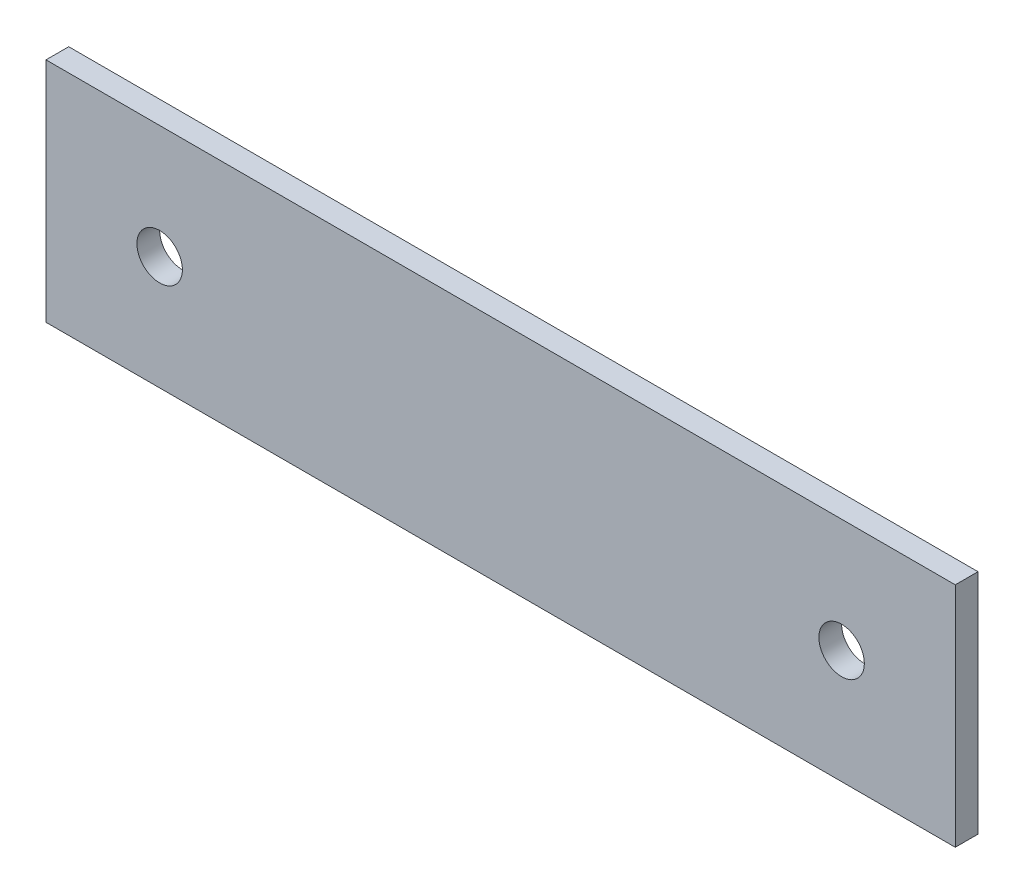
ISO-10303-21;
HEADER;
FILE_DESCRIPTION(('STEP AP214'),'2;1');
FILE_NAME('part.step','',(''),(''),'','','');
FILE_SCHEMA(('AUTOMOTIVE_DESIGN { 1 0 10303 214 1 1 1 1 }'));
ENDSEC;
DATA;
#1=APPLICATION_CONTEXT('core data for automotive mechanical design processes');
#2=APPLICATION_PROTOCOL_DEFINITION('international standard','automotive_design',2000,#1);
#3=PRODUCT_CONTEXT('',#1,'mechanical');
#4=PRODUCT('Part','Part','',(#3));
#5=PRODUCT_RELATED_PRODUCT_CATEGORY('part','',(#4));
#6=PRODUCT_DEFINITION_FORMATION('','',#4);
#7=PRODUCT_DEFINITION_CONTEXT('part definition',#1,'design');
#8=PRODUCT_DEFINITION('design','',#6,#7);
#9=PRODUCT_DEFINITION_SHAPE('','',#8);
#10=(LENGTH_UNIT() NAMED_UNIT(*) SI_UNIT(.MILLI.,.METRE.));
#11=(NAMED_UNIT(*) PLANE_ANGLE_UNIT() SI_UNIT($,.RADIAN.));
#12=(NAMED_UNIT(*) SI_UNIT($,.STERADIAN.) SOLID_ANGLE_UNIT());
#13=UNCERTAINTY_MEASURE_WITH_UNIT(LENGTH_MEASURE(1.E-05),#10,'distance_accuracy_value','');
#14=(GEOMETRIC_REPRESENTATION_CONTEXT(3) GLOBAL_UNCERTAINTY_ASSIGNED_CONTEXT((#13)) GLOBAL_UNIT_ASSIGNED_CONTEXT((#10,
#11,#12)) REPRESENTATION_CONTEXT('',''));
#15=CARTESIAN_POINT('',(0.,0.,0.));
#16=DIRECTION('',(0.,0.,1.));
#17=DIRECTION('',(1.,0.,0.));
#18=AXIS2_PLACEMENT_3D('',#15,#16,#17);
#19=CARTESIAN_POINT('',(40.,10.,2.));
#20=DIRECTION('',(-1.,0.,0.));
#21=DIRECTION('',(0.,-1.,0.));
#22=AXIS2_PLACEMENT_3D('',#19,#20,#21);
#23=PLANE('',#22);
#24=DIRECTION('',(0.,1.,0.));
#25=VECTOR('',#24,1.);
#26=CARTESIAN_POINT('',(40.,10.,0.));
#27=LINE('',#26,#25);
#28=CARTESIAN_POINT('',(40.,-10.,0.));
#29=VERTEX_POINT('',#28);
#30=CARTESIAN_POINT('',(40.,10.,0.));
#31=VERTEX_POINT('',#30);
#32=EDGE_CURVE('E97',#29,#31,#27,.T.);
#33=ORIENTED_EDGE('',*,*,#32,.T.);
#34=DIRECTION('',(0.,0.,-1.));
#35=VECTOR('',#34,1.);
#36=CARTESIAN_POINT('',(40.,10.,2.));
#37=LINE('',#36,#35);
#38=CARTESIAN_POINT('',(40.,10.,2.));
#39=VERTEX_POINT('',#38);
#40=EDGE_CURVE('E11',#39,#31,#37,.T.);
#41=ORIENTED_EDGE('',*,*,#40,.F.);
#42=DIRECTION('',(0.,1.,0.));
#43=VECTOR('',#42,1.);
#44=CARTESIAN_POINT('',(40.,10.,2.));
#45=LINE('',#44,#43);
#46=CARTESIAN_POINT('',(40.,-10.,2.));
#47=VERTEX_POINT('',#46);
#48=EDGE_CURVE('E85',#47,#39,#45,.T.);
#49=ORIENTED_EDGE('',*,*,#48,.F.);
#50=DIRECTION('',(0.,0.,-1.));
#51=VECTOR('',#50,1.);
#52=CARTESIAN_POINT('',(40.,-10.,2.));
#53=LINE('',#52,#51);
#54=EDGE_CURVE('E93',#47,#29,#53,.T.);
#55=ORIENTED_EDGE('',*,*,#54,.T.);
#56=EDGE_LOOP('',(#33,#41,#49,#55));
#57=FACE_BOUND('',#56,.T.);
#58=ADVANCED_FACE('F34',(#57),#23,.F.);
#59=CARTESIAN_POINT('',(-40.,10.,2.));
#60=DIRECTION('',(0.,-1.,0.));
#61=DIRECTION('',(1.,0.,0.));
#62=AXIS2_PLACEMENT_3D('',#59,#60,#61);
#63=PLANE('',#62);
#64=DIRECTION('',(-1.,0.,0.));
#65=VECTOR('',#64,1.);
#66=CARTESIAN_POINT('',(-40.,10.,0.));
#67=LINE('',#66,#65);
#68=CARTESIAN_POINT('',(-40.,10.,0.));
#69=VERTEX_POINT('',#68);
#70=EDGE_CURVE('E89',#31,#69,#67,.T.);
#71=ORIENTED_EDGE('',*,*,#70,.T.);
#72=DIRECTION('',(0.,0.,-1.));
#73=VECTOR('',#72,1.);
#74=CARTESIAN_POINT('',(-40.,10.,2.));
#75=LINE('',#74,#73);
#76=CARTESIAN_POINT('',(-40.,10.,2.));
#77=VERTEX_POINT('',#76);
#78=EDGE_CURVE('E42',#77,#69,#75,.T.);
#79=ORIENTED_EDGE('',*,*,#78,.F.);
#80=DIRECTION('',(-1.,0.,0.));
#81=VECTOR('',#80,1.);
#82=CARTESIAN_POINT('',(-40.,10.,2.));
#83=LINE('',#82,#81);
#84=EDGE_CURVE('E80',#39,#77,#83,.T.);
#85=ORIENTED_EDGE('',*,*,#84,.F.);
#86=ORIENTED_EDGE('',*,*,#40,.T.);
#87=EDGE_LOOP('',(#71,#79,#85,#86));
#88=FACE_BOUND('',#87,.T.);
#89=ADVANCED_FACE('F88',(#88),#63,.F.);
#90=CARTESIAN_POINT('',(-40.,10.,2.));
#91=DIRECTION('',(1.,0.,0.));
#92=DIRECTION('',(0.,0.,-1.));
#93=AXIS2_PLACEMENT_3D('',#90,#91,#92);
#94=PLANE('',#93);
#95=DIRECTION('',(0.,-1.,0.));
#96=VECTOR('',#95,1.);
#97=CARTESIAN_POINT('',(-40.,10.,0.));
#98=LINE('',#97,#96);
#99=CARTESIAN_POINT('',(-40.,-10.,0.));
#100=VERTEX_POINT('',#99);
#101=EDGE_CURVE('E67',#69,#100,#98,.T.);
#102=ORIENTED_EDGE('',*,*,#101,.T.);
#103=DIRECTION('',(0.,0.,-1.));
#104=VECTOR('',#103,1.);
#105=CARTESIAN_POINT('',(-40.,-10.,2.));
#106=LINE('',#105,#104);
#107=CARTESIAN_POINT('',(-40.,-10.,2.));
#108=VERTEX_POINT('',#107);
#109=EDGE_CURVE('E90',#108,#100,#106,.T.);
#110=ORIENTED_EDGE('',*,*,#109,.F.);
#111=DIRECTION('',(0.,-1.,0.));
#112=VECTOR('',#111,1.);
#113=CARTESIAN_POINT('',(-40.,10.,2.));
#114=LINE('',#113,#112);
#115=EDGE_CURVE('E83',#77,#108,#114,.T.);
#116=ORIENTED_EDGE('',*,*,#115,.F.);
#117=ORIENTED_EDGE('',*,*,#78,.T.);
#118=EDGE_LOOP('',(#102,#110,#116,#117));
#119=FACE_BOUND('',#118,.T.);
#120=ADVANCED_FACE('F91',(#119),#94,.F.);
#121=CARTESIAN_POINT('',(-40.,-10.,2.));
#122=DIRECTION('',(0.,1.,0.));
#123=DIRECTION('',(0.,0.,1.));
#124=AXIS2_PLACEMENT_3D('',#121,#122,#123);
#125=PLANE('',#124);
#126=DIRECTION('',(1.,0.,0.));
#127=VECTOR('',#126,1.);
#128=CARTESIAN_POINT('',(-40.,-10.,0.));
#129=LINE('',#128,#127);
#130=EDGE_CURVE('E73',#100,#29,#129,.T.);
#131=ORIENTED_EDGE('',*,*,#130,.T.);
#132=ORIENTED_EDGE('',*,*,#54,.F.);
#133=DIRECTION('',(1.,0.,0.));
#134=VECTOR('',#133,1.);
#135=CARTESIAN_POINT('',(-40.,-10.,2.));
#136=LINE('',#135,#134);
#137=EDGE_CURVE('E50',#108,#47,#136,.T.);
#138=ORIENTED_EDGE('',*,*,#137,.F.);
#139=ORIENTED_EDGE('',*,*,#109,.T.);
#140=EDGE_LOOP('',(#131,#132,#138,#139));
#141=FACE_BOUND('',#140,.T.);
#142=ADVANCED_FACE('F105',(#141),#125,.F.);
#143=CARTESIAN_POINT('',(0.,0.,2.));
#144=DIRECTION('',(0.,0.,1.));
#145=DIRECTION('',(1.,0.,0.));
#146=AXIS2_PLACEMENT_3D('',#143,#144,#145);
#147=PLANE('',#146);
#148=CARTESIAN_POINT('',(-30.,0.,2.));
#149=DIRECTION('',(0.,0.,1.));
#150=DIRECTION('',(1.,0.,0.));
#151=AXIS2_PLACEMENT_3D('',#148,#149,#150);
#152=CIRCLE('',#151,2.);
#153=CARTESIAN_POINT('',(-28.,0.,2.));
#154=VERTEX_POINT('',#153);
#155=EDGE_CURVE('E117',#154,#154,#152,.T.);
#156=ORIENTED_EDGE('',*,*,#155,.F.);
#157=EDGE_LOOP('',(#156));
#158=FACE_BOUND('',#157,.T.);
#159=CARTESIAN_POINT('',(30.,0.,2.));
#160=DIRECTION('',(0.,0.,1.));
#161=DIRECTION('',(1.,0.,0.));
#162=AXIS2_PLACEMENT_3D('',#159,#160,#161);
#163=CIRCLE('',#162,2.00000000000001);
#164=CARTESIAN_POINT('',(32.,0.,2.));
#165=VERTEX_POINT('',#164);
#166=EDGE_CURVE('E111',#165,#165,#163,.T.);
#167=ORIENTED_EDGE('',*,*,#166,.F.);
#168=EDGE_LOOP('',(#167));
#169=FACE_BOUND('',#168,.T.);
#170=ORIENTED_EDGE('',*,*,#48,.T.);
#171=ORIENTED_EDGE('',*,*,#84,.T.);
#172=ORIENTED_EDGE('',*,*,#115,.T.);
#173=ORIENTED_EDGE('',*,*,#137,.T.);
#174=EDGE_LOOP('',(#170,#171,#172,#173));
#175=FACE_BOUND('',#174,.T.);
#176=ADVANCED_FACE('F81',(#158,#169,#175),#147,.T.);
#177=CARTESIAN_POINT('',(0.,0.,0.));
#178=DIRECTION('',(0.,0.,1.));
#179=DIRECTION('',(1.,0.,0.));
#180=AXIS2_PLACEMENT_3D('',#177,#178,#179);
#181=PLANE('',#180);
#182=CARTESIAN_POINT('',(-30.,0.,0.));
#183=DIRECTION('',(0.,0.,1.));
#184=DIRECTION('',(1.,0.,0.));
#185=AXIS2_PLACEMENT_3D('',#182,#183,#184);
#186=CIRCLE('',#185,2.);
#187=CARTESIAN_POINT('',(-28.,0.,0.));
#188=VERTEX_POINT('',#187);
#189=EDGE_CURVE('E100',#188,#188,#186,.T.);
#190=ORIENTED_EDGE('',*,*,#189,.T.);
#191=EDGE_LOOP('',(#190));
#192=FACE_BOUND('',#191,.T.);
#193=CARTESIAN_POINT('',(30.,0.,0.));
#194=DIRECTION('',(0.,0.,1.));
#195=DIRECTION('',(1.,0.,0.));
#196=AXIS2_PLACEMENT_3D('',#193,#194,#195);
#197=CIRCLE('',#196,2.00000000000001);
#198=CARTESIAN_POINT('',(32.,0.,0.));
#199=VERTEX_POINT('',#198);
#200=EDGE_CURVE('E114',#199,#199,#197,.T.);
#201=ORIENTED_EDGE('',*,*,#200,.T.);
#202=EDGE_LOOP('',(#201));
#203=FACE_BOUND('',#202,.T.);
#204=ORIENTED_EDGE('',*,*,#32,.F.);
#205=ORIENTED_EDGE('',*,*,#130,.F.);
#206=ORIENTED_EDGE('',*,*,#101,.F.);
#207=ORIENTED_EDGE('',*,*,#70,.F.);
#208=EDGE_LOOP('',(#204,#205,#206,#207));
#209=FACE_BOUND('',#208,.T.);
#210=ADVANCED_FACE('F108',(#192,#203,#209),#181,.F.);
#211=CARTESIAN_POINT('',(30.,0.,0.));
#212=DIRECTION('',(0.,0.,1.));
#213=DIRECTION('',(1.,0.,0.));
#214=AXIS2_PLACEMENT_3D('',#211,#212,#213);
#215=CYLINDRICAL_SURFACE('',#214,2.00000000000001);
#216=ORIENTED_EDGE('',*,*,#200,.F.);
#217=EDGE_LOOP('',(#216));
#218=FACE_BOUND('',#217,.T.);
#219=ORIENTED_EDGE('',*,*,#166,.T.);
#220=EDGE_LOOP('',(#219));
#221=FACE_BOUND('',#220,.T.);
#222=ADVANCED_FACE('F128',(#218,#221),#215,.F.);
#223=CARTESIAN_POINT('',(-30.,0.,0.));
#224=DIRECTION('',(0.,0.,1.));
#225=DIRECTION('',(1.,0.,0.));
#226=AXIS2_PLACEMENT_3D('',#223,#224,#225);
#227=CYLINDRICAL_SURFACE('',#226,2.);
#228=ORIENTED_EDGE('',*,*,#189,.F.);
#229=EDGE_LOOP('',(#228));
#230=FACE_BOUND('',#229,.T.);
#231=ORIENTED_EDGE('',*,*,#155,.T.);
#232=EDGE_LOOP('',(#231));
#233=FACE_BOUND('',#232,.T.);
#234=ADVANCED_FACE('F125',(#230,#233),#227,.F.);
#235=CLOSED_SHELL('',(#58,#89,#120,#142,#176,#210,#222,#234));
#236=MANIFOLD_SOLID_BREP('B2',#235);
#237=ADVANCED_BREP_SHAPE_REPRESENTATION('',(#18,#236),#14);
#238=SHAPE_DEFINITION_REPRESENTATION(#9,#237);
ENDSEC;
END-ISO-10303-21;
